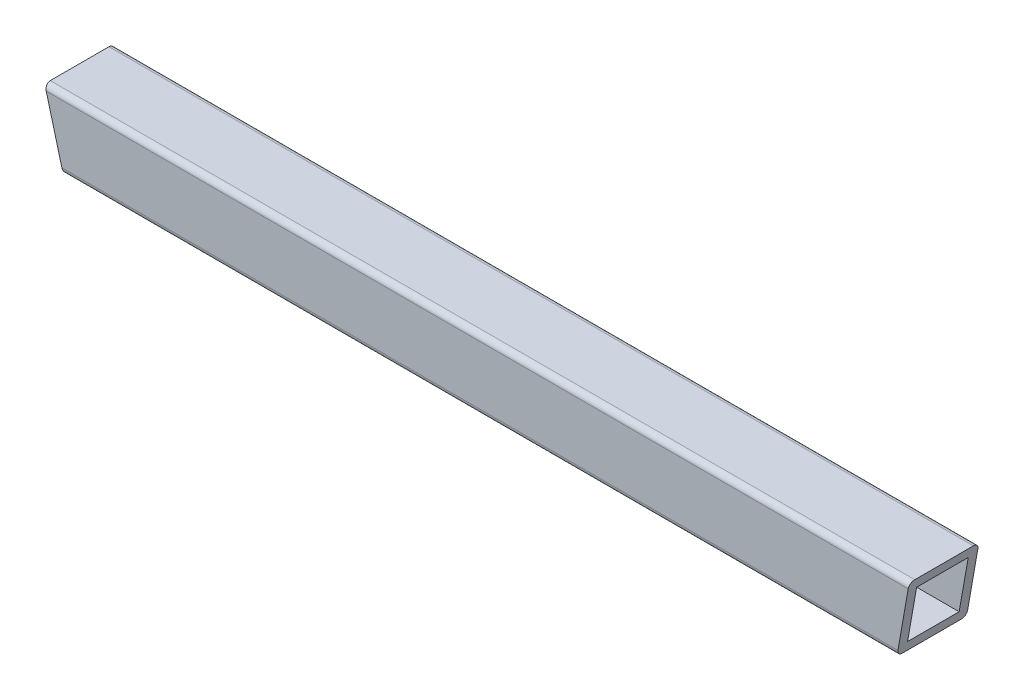
ISO-10303-21;
HEADER;
FILE_DESCRIPTION(('STEP AP214'),'2;1');
FILE_NAME('part.step','',(''),(''),'','','');
FILE_SCHEMA(('AUTOMOTIVE_DESIGN { 1 0 10303 214 1 1 1 1 }'));
ENDSEC;
DATA;
#1=APPLICATION_CONTEXT('core data for automotive mechanical design processes');
#2=APPLICATION_PROTOCOL_DEFINITION('international standard','automotive_design',2000,#1);
#3=PRODUCT_CONTEXT('',#1,'mechanical');
#4=PRODUCT('Part','Part','',(#3));
#5=PRODUCT_RELATED_PRODUCT_CATEGORY('part','',(#4));
#6=PRODUCT_DEFINITION_FORMATION('','',#4);
#7=PRODUCT_DEFINITION_CONTEXT('part definition',#1,'design');
#8=PRODUCT_DEFINITION('design','',#6,#7);
#9=PRODUCT_DEFINITION_SHAPE('','',#8);
#10=(LENGTH_UNIT() NAMED_UNIT(*) SI_UNIT(.MILLI.,.METRE.));
#11=(NAMED_UNIT(*) PLANE_ANGLE_UNIT() SI_UNIT($,.RADIAN.));
#12=(NAMED_UNIT(*) SI_UNIT($,.STERADIAN.) SOLID_ANGLE_UNIT());
#13=UNCERTAINTY_MEASURE_WITH_UNIT(LENGTH_MEASURE(1.E-05),#10,'distance_accuracy_value','');
#14=(GEOMETRIC_REPRESENTATION_CONTEXT(3) GLOBAL_UNCERTAINTY_ASSIGNED_CONTEXT((#13)) GLOBAL_UNIT_ASSIGNED_CONTEXT((#10,
#11,#12)) REPRESENTATION_CONTEXT('',''));
#15=CARTESIAN_POINT('',(0.,0.,0.));
#16=DIRECTION('',(0.,0.,1.));
#17=DIRECTION('',(1.,0.,0.));
#18=AXIS2_PLACEMENT_3D('',#15,#16,#17);
#19=CARTESIAN_POINT('',(393.7,20.574,20.574));
#20=DIRECTION('',(0.,0.,-1.));
#21=DIRECTION('',(0.,1.,0.));
#22=AXIS2_PLACEMENT_3D('',#19,#20,#21);
#23=PLANE('',#22);
#24=DIRECTION('',(0.258819045102473,-0.965925826289081,0.));
#25=VECTOR('',#24,1.);
#26=CARTESIAN_POINT('',(33.8914940981492,-75.8363985862307,20.574));
#27=LINE('',#26,#25);
#28=CARTESIAN_POINT('',(8.05840565501115,20.574,20.574));
#29=VERTEX_POINT('',#28);
#30=CARTESIAN_POINT('',(10.5765921654783,11.176,20.574));
#31=VERTEX_POINT('',#30);
#32=EDGE_CURVE('E196',#29,#31,#27,.T.);
#33=ORIENTED_EDGE('',*,*,#32,.F.);
#34=DIRECTION('',(-1.,0.,0.));
#35=VECTOR('',#34,1.);
#36=CARTESIAN_POINT('',(393.7,20.574,20.574));
#37=LINE('',#36,#35);
#38=CARTESIAN_POINT('',(164.835937065919,20.574,20.574));
#39=VERTEX_POINT('',#38);
#40=EDGE_CURVE('E185',#39,#29,#37,.T.);
#41=ORIENTED_EDGE('',*,*,#40,.F.);
#42=DIRECTION('',(0.173648177666934,0.984807753012207,0.));
#43=VECTOR('',#42,1.);
#44=CARTESIAN_POINT('',(171.737032981841,59.7120598034055,20.574));
#45=LINE('',#44,#43);
#46=CARTESIAN_POINT('',(163.17881610122,11.176,20.574));
#47=VERTEX_POINT('',#46);
#48=EDGE_CURVE('E197',#47,#39,#45,.T.);
#49=ORIENTED_EDGE('',*,*,#48,.F.);
#50=DIRECTION('',(-1.,0.,0.));
#51=VECTOR('',#50,1.);
#52=CARTESIAN_POINT('',(393.7,11.176,20.574));
#53=LINE('',#52,#51);
#54=EDGE_CURVE('E49',#47,#31,#53,.T.);
#55=ORIENTED_EDGE('',*,*,#54,.T.);
#56=EDGE_LOOP('',(#33,#41,#49,#55));
#57=FACE_BOUND('',#56,.T.);
#58=ADVANCED_FACE('F45',(#57),#23,.T.);
#59=CARTESIAN_POINT('',(393.7,20.574,11.176));
#60=DIRECTION('',(0.,-1.,0.));
#61=DIRECTION('',(0.,0.,-1.));
#62=AXIS2_PLACEMENT_3D('',#59,#60,#61);
#63=PLANE('',#62);
#64=DIRECTION('',(0.,0.,1.));
#65=VECTOR('',#64,1.);
#66=CARTESIAN_POINT('',(8.05840565501115,20.574,11.176));
#67=LINE('',#66,#65);
#68=CARTESIAN_POINT('',(8.05840565501115,20.574,11.176));
#69=VERTEX_POINT('',#68);
#70=EDGE_CURVE('E206',#69,#29,#67,.T.);
#71=ORIENTED_EDGE('',*,*,#70,.F.);
#72=DIRECTION('',(-1.,0.,0.));
#73=VECTOR('',#72,1.);
#74=CARTESIAN_POINT('',(393.7,20.574,11.176));
#75=LINE('',#74,#73);
#76=CARTESIAN_POINT('',(164.835937065919,20.574,11.176));
#77=VERTEX_POINT('',#76);
#78=EDGE_CURVE('E183',#77,#69,#75,.T.);
#79=ORIENTED_EDGE('',*,*,#78,.F.);
#80=DIRECTION('',(0.,0.,-1.));
#81=VECTOR('',#80,1.);
#82=CARTESIAN_POINT('',(164.835937065919,20.574,11.176));
#83=LINE('',#82,#81);
#84=EDGE_CURVE('E222',#39,#77,#83,.T.);
#85=ORIENTED_EDGE('',*,*,#84,.F.);
#86=ORIENTED_EDGE('',*,*,#40,.T.);
#87=EDGE_LOOP('',(#71,#79,#85,#86));
#88=FACE_BOUND('',#87,.T.);
#89=ADVANCED_FACE('F271',(#88),#63,.T.);
#90=CARTESIAN_POINT('',(393.7,11.176,11.176));
#91=DIRECTION('',(0.,0.,1.));
#92=DIRECTION('',(1.,0.,0.));
#93=AXIS2_PLACEMENT_3D('',#90,#91,#92);
#94=PLANE('',#93);
#95=DIRECTION('',(-0.258819045102473,0.965925826289081,0.));
#96=VECTOR('',#95,1.);
#97=CARTESIAN_POINT('',(36.2409940981488,-84.604851958614,11.176));
#98=LINE('',#97,#96);
#99=CARTESIAN_POINT('',(10.5765921654783,11.176,11.176));
#100=VERTEX_POINT('',#99);
#101=EDGE_CURVE('E204',#100,#69,#98,.T.);
#102=ORIENTED_EDGE('',*,*,#101,.F.);
#103=DIRECTION('',(-1.,0.,0.));
#104=VECTOR('',#103,1.);
#105=CARTESIAN_POINT('',(393.7,11.176,11.176));
#106=LINE('',#105,#104);
#107=CARTESIAN_POINT('',(163.17881610122,11.176,11.176));
#108=VERTEX_POINT('',#107);
#109=EDGE_CURVE('E179',#108,#100,#106,.T.);
#110=ORIENTED_EDGE('',*,*,#109,.F.);
#111=DIRECTION('',(-0.173648177666934,-0.984807753012207,0.));
#112=VECTOR('',#111,1.);
#113=CARTESIAN_POINT('',(170.129880328353,50.5974441783325,11.176));
#114=LINE('',#113,#112);
#115=EDGE_CURVE('E220',#77,#108,#114,.T.);
#116=ORIENTED_EDGE('',*,*,#115,.F.);
#117=ORIENTED_EDGE('',*,*,#78,.T.);
#118=EDGE_LOOP('',(#102,#110,#116,#117));
#119=FACE_BOUND('',#118,.T.);
#120=ADVANCED_FACE('F276',(#119),#94,.T.);
#121=CARTESIAN_POINT('',(393.7,11.176,20.574));
#122=DIRECTION('',(0.,1.,0.));
#123=DIRECTION('',(0.,0.,1.));
#124=AXIS2_PLACEMENT_3D('',#121,#122,#123);
#125=PLANE('',#124);
#126=DIRECTION('',(0.,0.,-1.));
#127=VECTOR('',#126,1.);
#128=CARTESIAN_POINT('',(10.5765921654783,11.176,20.574));
#129=LINE('',#128,#127);
#130=EDGE_CURVE('E151',#31,#100,#129,.T.);
#131=ORIENTED_EDGE('',*,*,#130,.F.);
#132=ORIENTED_EDGE('',*,*,#54,.F.);
#133=DIRECTION('',(0.,0.,1.));
#134=VECTOR('',#133,1.);
#135=CARTESIAN_POINT('',(163.17881610122,11.176,20.574));
#136=LINE('',#135,#134);
#137=EDGE_CURVE('E182',#108,#47,#136,.T.);
#138=ORIENTED_EDGE('',*,*,#137,.F.);
#139=ORIENTED_EDGE('',*,*,#109,.T.);
#140=EDGE_LOOP('',(#131,#132,#138,#139));
#141=FACE_BOUND('',#140,.T.);
#142=ADVANCED_FACE('F47',(#141),#125,.T.);
#143=CARTESIAN_POINT('',(165.127052911068,22.225,22.225));
#144=DIRECTION('',(-0.984807753012207,0.173648177666934,0.));
#145=DIRECTION('',(-0.173648177666934,-0.984807753012207,0.));
#146=AXIS2_PLACEMENT_3D('',#143,#144,#145);
#147=PLANE('',#146);
#148=ORIENTED_EDGE('',*,*,#137,.T.);
#149=ORIENTED_EDGE('',*,*,#48,.T.);
#150=ORIENTED_EDGE('',*,*,#84,.T.);
#151=ORIENTED_EDGE('',*,*,#115,.T.);
#152=EDGE_LOOP('',(#148,#149,#150,#151));
#153=FACE_BOUND('',#152,.T.);
#154=DIRECTION('',(0.,0.,-1.));
#155=VECTOR('',#154,1.);
#156=CARTESIAN_POINT('',(162.887700256071,9.525,22.225));
#157=LINE('',#156,#155);
#158=CARTESIAN_POINT('',(162.887700256071,9.525,21.209));
#159=VERTEX_POINT('',#158);
#160=CARTESIAN_POINT('',(162.88770025607,9.52499999999369,10.541));
#161=VERTEX_POINT('',#160);
#162=EDGE_CURVE('E136',#159,#161,#157,.T.);
#163=ORIENTED_EDGE('',*,*,#162,.T.);
#164=CARTESIAN_POINT('',(163.066848468469,10.5409999999937,10.541));
#165=DIRECTION('',(-0.984807753012207,0.173648177666934,0.));
#166=DIRECTION('',(-0.173648177666934,-0.984807753012207,0.));
#167=AXIS2_PLACEMENT_3D('',#164,#165,#166);
#168=ELLIPSE('',#167,1.03167343767592,1.016);
#169=CARTESIAN_POINT('',(163.066848468471,10.541,9.525));
#170=VERTEX_POINT('',#169);
#171=EDGE_CURVE('E133',#170,#161,#168,.T.);
#172=ORIENTED_EDGE('',*,*,#171,.F.);
#173=DIRECTION('',(0.173648177666934,0.984807753012207,0.));
#174=VECTOR('',#173,1.);
#175=CARTESIAN_POINT('',(165.127052911068,22.225,9.525));
#176=LINE('',#175,#174);
#177=CARTESIAN_POINT('',(164.947904698667,21.2089999999938,9.525));
#178=VERTEX_POINT('',#177);
#179=EDGE_CURVE('E130',#170,#178,#176,.T.);
#180=ORIENTED_EDGE('',*,*,#179,.T.);
#181=CARTESIAN_POINT('',(164.947904698667,21.2089999999938,10.541));
#182=DIRECTION('',(-0.984807753012207,0.173648177666934,0.));
#183=DIRECTION('',(-0.173648177666934,-0.984807753012207,0.));
#184=AXIS2_PLACEMENT_3D('',#181,#182,#183);
#185=ELLIPSE('',#184,1.03167343767592,1.016);
#186=CARTESIAN_POINT('',(165.127052911068,22.225,10.541));
#187=VERTEX_POINT('',#186);
#188=EDGE_CURVE('E166',#187,#178,#185,.T.);
#189=ORIENTED_EDGE('',*,*,#188,.F.);
#190=DIRECTION('',(0.,0.,-1.));
#191=VECTOR('',#190,1.);
#192=CARTESIAN_POINT('',(165.127052911068,22.225,22.225));
#193=LINE('',#192,#191);
#194=CARTESIAN_POINT('',(165.127052911067,22.2249999999938,21.209));
#195=VERTEX_POINT('',#194);
#196=EDGE_CURVE('E165',#195,#187,#193,.T.);
#197=ORIENTED_EDGE('',*,*,#196,.F.);
#198=CARTESIAN_POINT('',(164.947904698667,21.2089999999938,21.209));
#199=DIRECTION('',(-0.984807753012207,0.173648177666934,0.));
#200=DIRECTION('',(-0.173648177666934,-0.984807753012207,0.));
#201=AXIS2_PLACEMENT_3D('',#198,#199,#200);
#202=ELLIPSE('',#201,1.03167343767592,1.016);
#203=CARTESIAN_POINT('',(164.947904698669,21.209,22.225));
#204=VERTEX_POINT('',#203);
#205=EDGE_CURVE('E174',#204,#195,#202,.T.);
#206=ORIENTED_EDGE('',*,*,#205,.F.);
#207=DIRECTION('',(0.173648177666934,0.984807753012207,0.));
#208=VECTOR('',#207,1.);
#209=CARTESIAN_POINT('',(165.127052911068,22.225,22.225));
#210=LINE('',#209,#208);
#211=CARTESIAN_POINT('',(163.066848468471,10.541,22.225));
#212=VERTEX_POINT('',#211);
#213=EDGE_CURVE('E11',#212,#204,#210,.T.);
#214=ORIENTED_EDGE('',*,*,#213,.F.);
#215=CARTESIAN_POINT('',(163.066848468469,10.5409999999937,21.209));
#216=DIRECTION('',(-0.984807753012207,0.173648177666934,0.));
#217=DIRECTION('',(-0.173648177666934,-0.984807753012207,0.));
#218=AXIS2_PLACEMENT_3D('',#215,#216,#217);
#219=ELLIPSE('',#218,1.03167343767592,1.016);
#220=EDGE_CURVE('E212',#159,#212,#219,.T.);
#221=ORIENTED_EDGE('',*,*,#220,.F.);
#222=EDGE_LOOP('',(#163,#172,#180,#189,#197,#206,#214,#221));
#223=FACE_BOUND('',#222,.T.);
#224=ADVANCED_FACE('F134',(#153,#223),#147,.F.);
#225=CARTESIAN_POINT('',(7.61602153830743,22.225,22.225));
#226=DIRECTION('',(0.965925826289081,0.258819045102473,0.));
#227=DIRECTION('',(-0.258819045102473,0.965925826289081,0.));
#228=AXIS2_PLACEMENT_3D('',#225,#226,#227);
#229=PLANE('',#228);
#230=ORIENTED_EDGE('',*,*,#130,.T.);
#231=ORIENTED_EDGE('',*,*,#101,.T.);
#232=ORIENTED_EDGE('',*,*,#70,.T.);
#233=ORIENTED_EDGE('',*,*,#32,.T.);
#234=EDGE_LOOP('',(#230,#231,#232,#233));
#235=FACE_BOUND('',#234,.T.);
#236=DIRECTION('',(0.258819045102473,-0.965925826289081,0.));
#237=VECTOR('',#236,1.);
#238=CARTESIAN_POINT('',(7.61602153830743,22.225,22.225));
#239=LINE('',#238,#237);
#240=CARTESIAN_POINT('',(7.88825791781739,21.209,22.225));
#241=VERTEX_POINT('',#240);
#242=CARTESIAN_POINT('',(10.7467399026721,10.541,22.225));
#243=VERTEX_POINT('',#242);
#244=EDGE_CURVE('E55',#241,#243,#239,.T.);
#245=ORIENTED_EDGE('',*,*,#244,.F.);
#246=CARTESIAN_POINT('',(7.88825791782027,21.2089999999895,21.209));
#247=DIRECTION('',(0.965925826289081,0.258819045102473,0.));
#248=DIRECTION('',(-0.258819045102473,0.965925826289081,0.));
#249=AXIS2_PLACEMENT_3D('',#246,#247,#248);
#250=ELLIPSE('',#249,1.05184059929662,1.016);
#251=CARTESIAN_POINT('',(7.61602153830743,22.225,21.209));
#252=VERTEX_POINT('',#251);
#253=EDGE_CURVE('E170',#252,#241,#250,.T.);
#254=ORIENTED_EDGE('',*,*,#253,.F.);
#255=DIRECTION('',(0.,0.,-1.));
#256=VECTOR('',#255,1.);
#257=CARTESIAN_POINT('',(7.61602153830743,22.225,22.225));
#258=LINE('',#257,#256);
#259=CARTESIAN_POINT('',(7.61602153830743,22.225,10.541));
#260=VERTEX_POINT('',#259);
#261=EDGE_CURVE('E230',#252,#260,#258,.T.);
#262=ORIENTED_EDGE('',*,*,#261,.T.);
#263=CARTESIAN_POINT('',(7.88825791782027,21.2089999999895,10.541));
#264=DIRECTION('',(0.965925826289081,0.258819045102473,0.));
#265=DIRECTION('',(-0.258819045102473,0.965925826289081,0.));
#266=AXIS2_PLACEMENT_3D('',#263,#264,#265);
#267=ELLIPSE('',#266,1.05184059929662,1.016);
#268=CARTESIAN_POINT('',(7.88825791782022,21.2089999999895,9.525));
#269=VERTEX_POINT('',#268);
#270=EDGE_CURVE('E156',#269,#260,#267,.T.);
#271=ORIENTED_EDGE('',*,*,#270,.F.);
#272=DIRECTION('',(0.258819045102473,-0.965925826289081,0.));
#273=VECTOR('',#272,1.);
#274=CARTESIAN_POINT('',(7.61602153830743,22.225,9.525));
#275=LINE('',#274,#273);
#276=CARTESIAN_POINT('',(10.746739902672,10.541,9.525));
#277=VERTEX_POINT('',#276);
#278=EDGE_CURVE('E178',#269,#277,#275,.T.);
#279=ORIENTED_EDGE('',*,*,#278,.T.);
#280=CARTESIAN_POINT('',(10.7467399026749,10.5409999999895,10.541));
#281=DIRECTION('',(0.965925826289081,0.258819045102473,0.));
#282=DIRECTION('',(-0.258819045102473,0.965925826289081,0.));
#283=AXIS2_PLACEMENT_3D('',#280,#281,#282);
#284=ELLIPSE('',#283,1.05184059929662,1.016);
#285=CARTESIAN_POINT('',(11.018976282182,9.525,10.541));
#286=VERTEX_POINT('',#285);
#287=EDGE_CURVE('E142',#286,#277,#284,.T.);
#288=ORIENTED_EDGE('',*,*,#287,.F.);
#289=DIRECTION('',(0.,0.,-1.));
#290=VECTOR('',#289,1.);
#291=CARTESIAN_POINT('',(11.018976282182,9.525,22.225));
#292=LINE('',#291,#290);
#293=CARTESIAN_POINT('',(11.018976282182,9.525,21.209));
#294=VERTEX_POINT('',#293);
#295=EDGE_CURVE('E227',#294,#286,#292,.T.);
#296=ORIENTED_EDGE('',*,*,#295,.F.);
#297=CARTESIAN_POINT('',(10.7467399026749,10.5409999999895,21.209));
#298=DIRECTION('',(0.965925826289081,0.258819045102473,0.));
#299=DIRECTION('',(-0.258819045102473,0.965925826289081,0.));
#300=AXIS2_PLACEMENT_3D('',#297,#298,#299);
#301=ELLIPSE('',#300,1.05184059929662,1.016);
#302=EDGE_CURVE('E64',#243,#294,#301,.T.);
#303=ORIENTED_EDGE('',*,*,#302,.F.);
#304=EDGE_LOOP('',(#245,#254,#262,#271,#279,#288,#296,#303));
#305=FACE_BOUND('',#304,.T.);
#306=ADVANCED_FACE('F259',(#235,#305),#229,.F.);
#307=CARTESIAN_POINT('',(393.7,10.541,21.209));
#308=DIRECTION('',(-1.,0.,0.));
#309=DIRECTION('',(0.,-1.,0.));
#310=AXIS2_PLACEMENT_3D('',#307,#308,#309);
#311=CYLINDRICAL_SURFACE('',#310,1.016);
#312=DIRECTION('',(-1.,0.,0.));
#313=VECTOR('',#312,1.);
#314=CARTESIAN_POINT('',(393.7,10.541,22.225));
#315=LINE('',#314,#313);
#316=EDGE_CURVE('E175',#212,#243,#315,.T.);
#317=ORIENTED_EDGE('',*,*,#316,.T.);
#318=ORIENTED_EDGE('',*,*,#302,.T.);
#319=DIRECTION('',(-1.,0.,0.));
#320=VECTOR('',#319,1.);
#321=CARTESIAN_POINT('',(393.7,9.525,21.209));
#322=LINE('',#321,#320);
#323=EDGE_CURVE('E214',#159,#294,#322,.T.);
#324=ORIENTED_EDGE('',*,*,#323,.F.);
#325=ORIENTED_EDGE('',*,*,#220,.T.);
#326=EDGE_LOOP('',(#317,#318,#324,#325));
#327=FACE_BOUND('',#326,.T.);
#328=ADVANCED_FACE('F238',(#327),#311,.T.);
#329=CARTESIAN_POINT('',(393.7,9.525,21.209));
#330=DIRECTION('',(0.,1.,0.));
#331=DIRECTION('',(0.,0.,1.));
#332=AXIS2_PLACEMENT_3D('',#329,#330,#331);
#333=PLANE('',#332);
#334=ORIENTED_EDGE('',*,*,#323,.T.);
#335=ORIENTED_EDGE('',*,*,#295,.T.);
#336=DIRECTION('',(-1.,0.,0.));
#337=VECTOR('',#336,1.);
#338=CARTESIAN_POINT('',(393.7,9.525,10.541));
#339=LINE('',#338,#337);
#340=EDGE_CURVE('E159',#161,#286,#339,.T.);
#341=ORIENTED_EDGE('',*,*,#340,.F.);
#342=ORIENTED_EDGE('',*,*,#162,.F.);
#343=EDGE_LOOP('',(#334,#335,#341,#342));
#344=FACE_BOUND('',#343,.T.);
#345=ADVANCED_FACE('F236',(#344),#333,.F.);
#346=CARTESIAN_POINT('',(393.7,10.541,10.541));
#347=DIRECTION('',(-1.,0.,0.));
#348=DIRECTION('',(0.,-1.,0.));
#349=AXIS2_PLACEMENT_3D('',#346,#347,#348);
#350=CYLINDRICAL_SURFACE('',#349,1.016);
#351=ORIENTED_EDGE('',*,*,#340,.T.);
#352=ORIENTED_EDGE('',*,*,#287,.T.);
#353=DIRECTION('',(-1.,0.,0.));
#354=VECTOR('',#353,1.);
#355=CARTESIAN_POINT('',(393.7,10.541,9.525));
#356=LINE('',#355,#354);
#357=EDGE_CURVE('E141',#170,#277,#356,.T.);
#358=ORIENTED_EDGE('',*,*,#357,.F.);
#359=ORIENTED_EDGE('',*,*,#171,.T.);
#360=EDGE_LOOP('',(#351,#352,#358,#359));
#361=FACE_BOUND('',#360,.T.);
#362=ADVANCED_FACE('F154',(#361),#350,.T.);
#363=CARTESIAN_POINT('',(393.7,10.541,9.525));
#364=DIRECTION('',(0.,0.,1.));
#365=DIRECTION('',(1.,0.,0.));
#366=AXIS2_PLACEMENT_3D('',#363,#364,#365);
#367=PLANE('',#366);
#368=ORIENTED_EDGE('',*,*,#357,.T.);
#369=ORIENTED_EDGE('',*,*,#278,.F.);
#370=DIRECTION('',(-1.,0.,0.));
#371=VECTOR('',#370,1.);
#372=CARTESIAN_POINT('',(393.7,21.209,9.525));
#373=LINE('',#372,#371);
#374=EDGE_CURVE('E150',#178,#269,#373,.T.);
#375=ORIENTED_EDGE('',*,*,#374,.F.);
#376=ORIENTED_EDGE('',*,*,#179,.F.);
#377=EDGE_LOOP('',(#368,#369,#375,#376));
#378=FACE_BOUND('',#377,.T.);
#379=ADVANCED_FACE('F147',(#378),#367,.F.);
#380=CARTESIAN_POINT('',(393.7,21.209,10.541));
#381=DIRECTION('',(-1.,0.,0.));
#382=DIRECTION('',(0.,-1.,0.));
#383=AXIS2_PLACEMENT_3D('',#380,#381,#382);
#384=CYLINDRICAL_SURFACE('',#383,1.016);
#385=ORIENTED_EDGE('',*,*,#374,.T.);
#386=ORIENTED_EDGE('',*,*,#270,.T.);
#387=DIRECTION('',(-1.,0.,0.));
#388=VECTOR('',#387,1.);
#389=CARTESIAN_POINT('',(393.7,22.225,10.541));
#390=LINE('',#389,#388);
#391=EDGE_CURVE('E162',#187,#260,#390,.T.);
#392=ORIENTED_EDGE('',*,*,#391,.F.);
#393=ORIENTED_EDGE('',*,*,#188,.T.);
#394=EDGE_LOOP('',(#385,#386,#392,#393));
#395=FACE_BOUND('',#394,.T.);
#396=ADVANCED_FACE('F247',(#395),#384,.T.);
#397=CARTESIAN_POINT('',(393.7,22.225,10.541));
#398=DIRECTION('',(0.,-1.,0.));
#399=DIRECTION('',(0.,0.,-1.));
#400=AXIS2_PLACEMENT_3D('',#397,#398,#399);
#401=PLANE('',#400);
#402=ORIENTED_EDGE('',*,*,#391,.T.);
#403=ORIENTED_EDGE('',*,*,#261,.F.);
#404=DIRECTION('',(-1.,0.,0.));
#405=VECTOR('',#404,1.);
#406=CARTESIAN_POINT('',(393.7,22.225,21.209));
#407=LINE('',#406,#405);
#408=EDGE_CURVE('E167',#195,#252,#407,.T.);
#409=ORIENTED_EDGE('',*,*,#408,.F.);
#410=ORIENTED_EDGE('',*,*,#196,.T.);
#411=EDGE_LOOP('',(#402,#403,#409,#410));
#412=FACE_BOUND('',#411,.T.);
#413=ADVANCED_FACE('F250',(#412),#401,.F.);
#414=CARTESIAN_POINT('',(393.7,21.209,21.209));
#415=DIRECTION('',(-1.,0.,0.));
#416=DIRECTION('',(0.,-1.,0.));
#417=AXIS2_PLACEMENT_3D('',#414,#415,#416);
#418=CYLINDRICAL_SURFACE('',#417,1.016);
#419=ORIENTED_EDGE('',*,*,#408,.T.);
#420=ORIENTED_EDGE('',*,*,#253,.T.);
#421=DIRECTION('',(-1.,0.,0.));
#422=VECTOR('',#421,1.);
#423=CARTESIAN_POINT('',(393.7,21.209,22.225));
#424=LINE('',#423,#422);
#425=EDGE_CURVE('E171',#204,#241,#424,.T.);
#426=ORIENTED_EDGE('',*,*,#425,.F.);
#427=ORIENTED_EDGE('',*,*,#205,.T.);
#428=EDGE_LOOP('',(#419,#420,#426,#427));
#429=FACE_BOUND('',#428,.T.);
#430=ADVANCED_FACE('F255',(#429),#418,.T.);
#431=CARTESIAN_POINT('',(393.7,21.209,22.225));
#432=DIRECTION('',(0.,0.,-1.));
#433=DIRECTION('',(0.,1.,0.));
#434=AXIS2_PLACEMENT_3D('',#431,#432,#433);
#435=PLANE('',#434);
#436=ORIENTED_EDGE('',*,*,#425,.T.);
#437=ORIENTED_EDGE('',*,*,#244,.T.);
#438=ORIENTED_EDGE('',*,*,#316,.F.);
#439=ORIENTED_EDGE('',*,*,#213,.T.);
#440=EDGE_LOOP('',(#436,#437,#438,#439));
#441=FACE_BOUND('',#440,.T.);
#442=ADVANCED_FACE('F258',(#441),#435,.F.);
#443=CLOSED_SHELL('',(#58,#89,#120,#142,#224,#306,#328,#345,#362,#379,#396,#413,#430,#442));
#444=MANIFOLD_SOLID_BREP('B2',#443);
#445=ADVANCED_BREP_SHAPE_REPRESENTATION('',(#18,#444),#14);
#446=SHAPE_DEFINITION_REPRESENTATION(#9,#445);
ENDSEC;
END-ISO-10303-21;
